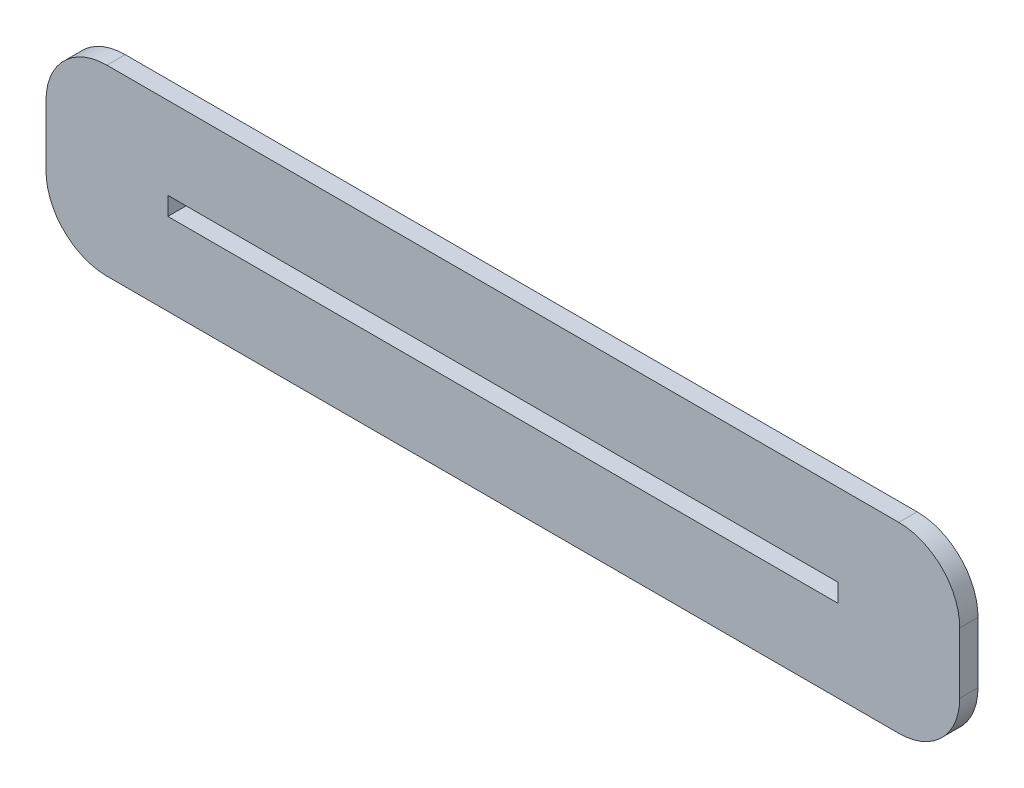
ISO-10303-21;
HEADER;
FILE_DESCRIPTION(('STEP AP214'),'2;1');
FILE_NAME('part.step','',(''),(''),'','','');
FILE_SCHEMA(('AUTOMOTIVE_DESIGN { 1 0 10303 214 1 1 1 1 }'));
ENDSEC;
DATA;
#1=APPLICATION_CONTEXT('core data for automotive mechanical design processes');
#2=APPLICATION_PROTOCOL_DEFINITION('international standard','automotive_design',2000,#1);
#3=PRODUCT_CONTEXT('',#1,'mechanical');
#4=PRODUCT('Part','Part','',(#3));
#5=PRODUCT_RELATED_PRODUCT_CATEGORY('part','',(#4));
#6=PRODUCT_DEFINITION_FORMATION('','',#4);
#7=PRODUCT_DEFINITION_CONTEXT('part definition',#1,'design');
#8=PRODUCT_DEFINITION('design','',#6,#7);
#9=PRODUCT_DEFINITION_SHAPE('','',#8);
#10=(LENGTH_UNIT() NAMED_UNIT(*) SI_UNIT(.MILLI.,.METRE.));
#11=(NAMED_UNIT(*) PLANE_ANGLE_UNIT() SI_UNIT($,.RADIAN.));
#12=(NAMED_UNIT(*) SI_UNIT($,.STERADIAN.) SOLID_ANGLE_UNIT());
#13=UNCERTAINTY_MEASURE_WITH_UNIT(LENGTH_MEASURE(1.E-05),#10,'distance_accuracy_value','');
#14=(GEOMETRIC_REPRESENTATION_CONTEXT(3) GLOBAL_UNCERTAINTY_ASSIGNED_CONTEXT((#13)) GLOBAL_UNIT_ASSIGNED_CONTEXT((#10,
#11,#12)) REPRESENTATION_CONTEXT('',''));
#15=CARTESIAN_POINT('',(0.,0.,0.));
#16=DIRECTION('',(0.,0.,1.));
#17=DIRECTION('',(1.,0.,0.));
#18=AXIS2_PLACEMENT_3D('',#15,#16,#17);
#19=CARTESIAN_POINT('',(0.,30.,3.));
#20=DIRECTION('',(0.,0.,-1.));
#21=DIRECTION('',(-1.,0.,0.));
#22=AXIS2_PLACEMENT_3D('',#19,#20,#21);
#23=PLANE('',#22);
#24=DIRECTION('',(-1.,0.,0.));
#25=VECTOR('',#24,1.);
#26=CARTESIAN_POINT('',(0.,30.,3.));
#27=LINE('',#26,#25);
#28=CARTESIAN_POINT('',(140.,30.,3.));
#29=VERTEX_POINT('',#28);
#30=CARTESIAN_POINT('',(10.,30.,3.));
#31=VERTEX_POINT('',#30);
#32=EDGE_CURVE('E171',#29,#31,#27,.T.);
#33=ORIENTED_EDGE('',*,*,#32,.T.);
#34=CARTESIAN_POINT('',(10.,20.,3.));
#35=DIRECTION('',(0.,0.,-1.));
#36=DIRECTION('',(-1.,0.,0.));
#37=AXIS2_PLACEMENT_3D('',#34,#35,#36);
#38=CIRCLE('',#37,10.);
#39=CARTESIAN_POINT('',(0.,20.,3.));
#40=VERTEX_POINT('',#39);
#41=EDGE_CURVE('E206',#31,#40,#38,.F.);
#42=ORIENTED_EDGE('',*,*,#41,.T.);
#43=DIRECTION('',(0.,-1.,0.));
#44=VECTOR('',#43,1.);
#45=CARTESIAN_POINT('',(0.,0.,3.));
#46=LINE('',#45,#44);
#47=CARTESIAN_POINT('',(0.,10.,3.));
#48=VERTEX_POINT('',#47);
#49=EDGE_CURVE('E163',#40,#48,#46,.T.);
#50=ORIENTED_EDGE('',*,*,#49,.T.);
#51=CARTESIAN_POINT('',(10.,10.,3.));
#52=DIRECTION('',(0.,0.,-1.));
#53=DIRECTION('',(-1.,0.,0.));
#54=AXIS2_PLACEMENT_3D('',#51,#52,#53);
#55=CIRCLE('',#54,10.);
#56=CARTESIAN_POINT('',(10.,0.,3.));
#57=VERTEX_POINT('',#56);
#58=EDGE_CURVE('E204',#48,#57,#55,.F.);
#59=ORIENTED_EDGE('',*,*,#58,.T.);
#60=DIRECTION('',(1.,0.,0.));
#61=VECTOR('',#60,1.);
#62=CARTESIAN_POINT('',(0.,0.,3.));
#63=LINE('',#62,#61);
#64=CARTESIAN_POINT('',(140.,0.,3.));
#65=VERTEX_POINT('',#64);
#66=EDGE_CURVE('E166',#57,#65,#63,.T.);
#67=ORIENTED_EDGE('',*,*,#66,.T.);
#68=CARTESIAN_POINT('',(140.,10.,3.));
#69=DIRECTION('',(0.,0.,-1.));
#70=DIRECTION('',(-1.,0.,0.));
#71=AXIS2_PLACEMENT_3D('',#68,#69,#70);
#72=CIRCLE('',#71,10.);
#73=CARTESIAN_POINT('',(150.,10.,3.));
#74=VERTEX_POINT('',#73);
#75=EDGE_CURVE('E52',#65,#74,#72,.F.);
#76=ORIENTED_EDGE('',*,*,#75,.T.);
#77=DIRECTION('',(0.,1.,0.));
#78=VECTOR('',#77,1.);
#79=CARTESIAN_POINT('',(150.,0.,3.));
#80=LINE('',#79,#78);
#81=CARTESIAN_POINT('',(150.,20.,3.));
#82=VERTEX_POINT('',#81);
#83=EDGE_CURVE('E169',#74,#82,#80,.T.);
#84=ORIENTED_EDGE('',*,*,#83,.T.);
#85=CARTESIAN_POINT('',(140.,20.,3.));
#86=DIRECTION('',(0.,0.,-1.));
#87=DIRECTION('',(-1.,0.,0.));
#88=AXIS2_PLACEMENT_3D('',#85,#86,#87);
#89=CIRCLE('',#88,10.);
#90=EDGE_CURVE('E201',#82,#29,#89,.F.);
#91=ORIENTED_EDGE('',*,*,#90,.T.);
#92=EDGE_LOOP('',(#33,#42,#50,#59,#67,#76,#84,#91));
#93=FACE_BOUND('',#92,.T.);
#94=DIRECTION('',(0.,1.,0.));
#95=VECTOR('',#94,1.);
#96=CARTESIAN_POINT('',(130.,13.5,3.));
#97=LINE('',#96,#95);
#98=CARTESIAN_POINT('',(130.,13.5,3.));
#99=VERTEX_POINT('',#98);
#100=CARTESIAN_POINT('',(130.,16.5,3.));
#101=VERTEX_POINT('',#100);
#102=EDGE_CURVE('E122',#99,#101,#97,.T.);
#103=ORIENTED_EDGE('',*,*,#102,.F.);
#104=DIRECTION('',(1.,0.,0.));
#105=VECTOR('',#104,1.);
#106=CARTESIAN_POINT('',(20.,13.5,3.));
#107=LINE('',#106,#105);
#108=CARTESIAN_POINT('',(20.,13.5,3.));
#109=VERTEX_POINT('',#108);
#110=EDGE_CURVE('E147',#109,#99,#107,.T.);
#111=ORIENTED_EDGE('',*,*,#110,.F.);
#112=DIRECTION('',(0.,-1.,0.));
#113=VECTOR('',#112,1.);
#114=CARTESIAN_POINT('',(20.,13.5,3.));
#115=LINE('',#114,#113);
#116=CARTESIAN_POINT('',(20.,16.5,3.));
#117=VERTEX_POINT('',#116);
#118=EDGE_CURVE('E145',#117,#109,#115,.T.);
#119=ORIENTED_EDGE('',*,*,#118,.F.);
#120=DIRECTION('',(-1.,0.,0.));
#121=VECTOR('',#120,1.);
#122=CARTESIAN_POINT('',(20.,16.5,3.));
#123=LINE('',#122,#121);
#124=EDGE_CURVE('E132',#101,#117,#123,.T.);
#125=ORIENTED_EDGE('',*,*,#124,.F.);
#126=EDGE_LOOP('',(#103,#111,#119,#125));
#127=FACE_BOUND('',#126,.T.);
#128=ADVANCED_FACE('F31',(#93,#127),#23,.F.);
#129=CARTESIAN_POINT('',(0.,30.,0.));
#130=DIRECTION('',(0.,0.,-1.));
#131=DIRECTION('',(-1.,0.,0.));
#132=AXIS2_PLACEMENT_3D('',#129,#130,#131);
#133=PLANE('',#132);
#134=DIRECTION('',(0.,-1.,0.));
#135=VECTOR('',#134,1.);
#136=CARTESIAN_POINT('',(0.,0.,0.));
#137=LINE('',#136,#135);
#138=CARTESIAN_POINT('',(0.,20.,0.));
#139=VERTEX_POINT('',#138);
#140=CARTESIAN_POINT('',(0.,10.,0.));
#141=VERTEX_POINT('',#140);
#142=EDGE_CURVE('E140',#139,#141,#137,.T.);
#143=ORIENTED_EDGE('',*,*,#142,.F.);
#144=CARTESIAN_POINT('',(10.,20.,0.));
#145=DIRECTION('',(0.,0.,-1.));
#146=DIRECTION('',(-1.,0.,0.));
#147=AXIS2_PLACEMENT_3D('',#144,#145,#146);
#148=CIRCLE('',#147,10.);
#149=CARTESIAN_POINT('',(10.,30.,0.));
#150=VERTEX_POINT('',#149);
#151=EDGE_CURVE('E194',#139,#150,#148,.T.);
#152=ORIENTED_EDGE('',*,*,#151,.T.);
#153=DIRECTION('',(-1.,0.,0.));
#154=VECTOR('',#153,1.);
#155=CARTESIAN_POINT('',(0.,30.,0.));
#156=LINE('',#155,#154);
#157=CARTESIAN_POINT('',(140.,30.,0.));
#158=VERTEX_POINT('',#157);
#159=EDGE_CURVE('E167',#158,#150,#156,.T.);
#160=ORIENTED_EDGE('',*,*,#159,.F.);
#161=CARTESIAN_POINT('',(140.,20.,0.));
#162=DIRECTION('',(0.,0.,-1.));
#163=DIRECTION('',(-1.,0.,0.));
#164=AXIS2_PLACEMENT_3D('',#161,#162,#163);
#165=CIRCLE('',#164,10.);
#166=CARTESIAN_POINT('',(150.,20.,0.));
#167=VERTEX_POINT('',#166);
#168=EDGE_CURVE('E188',#158,#167,#165,.T.);
#169=ORIENTED_EDGE('',*,*,#168,.T.);
#170=DIRECTION('',(0.,1.,0.));
#171=VECTOR('',#170,1.);
#172=CARTESIAN_POINT('',(150.,0.,0.));
#173=LINE('',#172,#171);
#174=CARTESIAN_POINT('',(150.,10.,0.));
#175=VERTEX_POINT('',#174);
#176=EDGE_CURVE('E180',#175,#167,#173,.T.);
#177=ORIENTED_EDGE('',*,*,#176,.F.);
#178=CARTESIAN_POINT('',(140.,10.,0.));
#179=DIRECTION('',(0.,0.,-1.));
#180=DIRECTION('',(-1.,0.,0.));
#181=AXIS2_PLACEMENT_3D('',#178,#179,#180);
#182=CIRCLE('',#181,10.);
#183=CARTESIAN_POINT('',(140.,0.,0.));
#184=VERTEX_POINT('',#183);
#185=EDGE_CURVE('E190',#175,#184,#182,.T.);
#186=ORIENTED_EDGE('',*,*,#185,.T.);
#187=DIRECTION('',(1.,0.,0.));
#188=VECTOR('',#187,1.);
#189=CARTESIAN_POINT('',(0.,0.,0.));
#190=LINE('',#189,#188);
#191=CARTESIAN_POINT('',(10.,0.,0.));
#192=VERTEX_POINT('',#191);
#193=EDGE_CURVE('E177',#192,#184,#190,.T.);
#194=ORIENTED_EDGE('',*,*,#193,.F.);
#195=CARTESIAN_POINT('',(10.,10.,0.));
#196=DIRECTION('',(0.,0.,-1.));
#197=DIRECTION('',(-1.,0.,0.));
#198=AXIS2_PLACEMENT_3D('',#195,#196,#197);
#199=CIRCLE('',#198,10.);
#200=EDGE_CURVE('E192',#192,#141,#199,.T.);
#201=ORIENTED_EDGE('',*,*,#200,.T.);
#202=EDGE_LOOP('',(#143,#152,#160,#169,#177,#186,#194,#201));
#203=FACE_BOUND('',#202,.T.);
#204=DIRECTION('',(1.,0.,0.));
#205=VECTOR('',#204,1.);
#206=CARTESIAN_POINT('',(20.,13.5,0.));
#207=LINE('',#206,#205);
#208=CARTESIAN_POINT('',(20.,13.5,0.));
#209=VERTEX_POINT('',#208);
#210=CARTESIAN_POINT('',(130.,13.5,0.));
#211=VERTEX_POINT('',#210);
#212=EDGE_CURVE('E133',#209,#211,#207,.T.);
#213=ORIENTED_EDGE('',*,*,#212,.T.);
#214=DIRECTION('',(0.,1.,0.));
#215=VECTOR('',#214,1.);
#216=CARTESIAN_POINT('',(130.,13.5,0.));
#217=LINE('',#216,#215);
#218=CARTESIAN_POINT('',(130.,16.5,0.));
#219=VERTEX_POINT('',#218);
#220=EDGE_CURVE('E151',#211,#219,#217,.T.);
#221=ORIENTED_EDGE('',*,*,#220,.T.);
#222=DIRECTION('',(-1.,0.,0.));
#223=VECTOR('',#222,1.);
#224=CARTESIAN_POINT('',(20.,16.5,0.));
#225=LINE('',#224,#223);
#226=CARTESIAN_POINT('',(20.,16.5,0.));
#227=VERTEX_POINT('',#226);
#228=EDGE_CURVE('E139',#219,#227,#225,.T.);
#229=ORIENTED_EDGE('',*,*,#228,.T.);
#230=DIRECTION('',(0.,-1.,0.));
#231=VECTOR('',#230,1.);
#232=CARTESIAN_POINT('',(20.,13.5,0.));
#233=LINE('',#232,#231);
#234=EDGE_CURVE('E154',#227,#209,#233,.T.);
#235=ORIENTED_EDGE('',*,*,#234,.T.);
#236=EDGE_LOOP('',(#213,#221,#229,#235));
#237=FACE_BOUND('',#236,.T.);
#238=ADVANCED_FACE('F222',(#203,#237),#133,.T.);
#239=CARTESIAN_POINT('',(0.,0.,3.));
#240=DIRECTION('',(1.,0.,0.));
#241=DIRECTION('',(0.,0.,-1.));
#242=AXIS2_PLACEMENT_3D('',#239,#240,#241);
#243=PLANE('',#242);
#244=ORIENTED_EDGE('',*,*,#49,.F.);
#245=DIRECTION('',(0.,0.,-1.));
#246=VECTOR('',#245,1.);
#247=CARTESIAN_POINT('',(0.,20.,3.));
#248=LINE('',#247,#246);
#249=EDGE_CURVE('E185',#40,#139,#248,.T.);
#250=ORIENTED_EDGE('',*,*,#249,.T.);
#251=ORIENTED_EDGE('',*,*,#142,.T.);
#252=DIRECTION('',(0.,0.,-1.));
#253=VECTOR('',#252,1.);
#254=CARTESIAN_POINT('',(0.,10.,3.));
#255=LINE('',#254,#253);
#256=EDGE_CURVE('E174',#141,#48,#255,.F.);
#257=ORIENTED_EDGE('',*,*,#256,.T.);
#258=EDGE_LOOP('',(#244,#250,#251,#257));
#259=FACE_BOUND('',#258,.T.);
#260=ADVANCED_FACE('F243',(#259),#243,.F.);
#261=CARTESIAN_POINT('',(0.,0.,3.));
#262=DIRECTION('',(0.,1.,0.));
#263=DIRECTION('',(0.,0.,1.));
#264=AXIS2_PLACEMENT_3D('',#261,#262,#263);
#265=PLANE('',#264);
#266=ORIENTED_EDGE('',*,*,#66,.F.);
#267=DIRECTION('',(0.,0.,-1.));
#268=VECTOR('',#267,1.);
#269=CARTESIAN_POINT('',(10.,0.,3.));
#270=LINE('',#269,#268);
#271=EDGE_CURVE('E210',#57,#192,#270,.T.);
#272=ORIENTED_EDGE('',*,*,#271,.T.);
#273=ORIENTED_EDGE('',*,*,#193,.T.);
#274=DIRECTION('',(0.,0.,-1.));
#275=VECTOR('',#274,1.);
#276=CARTESIAN_POINT('',(140.,0.,3.));
#277=LINE('',#276,#275);
#278=EDGE_CURVE('E208',#184,#65,#277,.F.);
#279=ORIENTED_EDGE('',*,*,#278,.T.);
#280=EDGE_LOOP('',(#266,#272,#273,#279));
#281=FACE_BOUND('',#280,.T.);
#282=ADVANCED_FACE('F216',(#281),#265,.F.);
#283=CARTESIAN_POINT('',(150.,0.,3.));
#284=DIRECTION('',(-1.,0.,0.));
#285=DIRECTION('',(0.,0.,1.));
#286=AXIS2_PLACEMENT_3D('',#283,#284,#285);
#287=PLANE('',#286);
#288=ORIENTED_EDGE('',*,*,#83,.F.);
#289=DIRECTION('',(0.,0.,-1.));
#290=VECTOR('',#289,1.);
#291=CARTESIAN_POINT('',(150.,10.,3.));
#292=LINE('',#291,#290);
#293=EDGE_CURVE('E11',#74,#175,#292,.T.);
#294=ORIENTED_EDGE('',*,*,#293,.T.);
#295=ORIENTED_EDGE('',*,*,#176,.T.);
#296=DIRECTION('',(0.,0.,-1.));
#297=VECTOR('',#296,1.);
#298=CARTESIAN_POINT('',(150.,20.,3.));
#299=LINE('',#298,#297);
#300=EDGE_CURVE('E39',#167,#82,#299,.F.);
#301=ORIENTED_EDGE('',*,*,#300,.T.);
#302=EDGE_LOOP('',(#288,#294,#295,#301));
#303=FACE_BOUND('',#302,.T.);
#304=ADVANCED_FACE('F228',(#303),#287,.F.);
#305=CARTESIAN_POINT('',(0.,30.,3.));
#306=DIRECTION('',(0.,-1.,0.));
#307=DIRECTION('',(0.,0.,-1.));
#308=AXIS2_PLACEMENT_3D('',#305,#306,#307);
#309=PLANE('',#308);
#310=ORIENTED_EDGE('',*,*,#159,.T.);
#311=DIRECTION('',(0.,0.,-1.));
#312=VECTOR('',#311,1.);
#313=CARTESIAN_POINT('',(10.,30.,3.));
#314=LINE('',#313,#312);
#315=EDGE_CURVE('E199',#150,#31,#314,.F.);
#316=ORIENTED_EDGE('',*,*,#315,.T.);
#317=ORIENTED_EDGE('',*,*,#32,.F.);
#318=DIRECTION('',(0.,0.,-1.));
#319=VECTOR('',#318,1.);
#320=CARTESIAN_POINT('',(140.,30.,3.));
#321=LINE('',#320,#319);
#322=EDGE_CURVE('E196',#29,#158,#321,.T.);
#323=ORIENTED_EDGE('',*,*,#322,.T.);
#324=EDGE_LOOP('',(#310,#316,#317,#323));
#325=FACE_BOUND('',#324,.T.);
#326=ADVANCED_FACE('F235',(#325),#309,.F.);
#327=CARTESIAN_POINT('',(130.,13.5,3.));
#328=DIRECTION('',(-1.,0.,0.));
#329=DIRECTION('',(0.,0.,1.));
#330=AXIS2_PLACEMENT_3D('',#327,#328,#329);
#331=PLANE('',#330);
#332=ORIENTED_EDGE('',*,*,#220,.F.);
#333=DIRECTION('',(0.,0.,-1.));
#334=VECTOR('',#333,1.);
#335=CARTESIAN_POINT('',(130.,13.5,3.));
#336=LINE('',#335,#334);
#337=EDGE_CURVE('E128',#99,#211,#336,.T.);
#338=ORIENTED_EDGE('',*,*,#337,.F.);
#339=ORIENTED_EDGE('',*,*,#102,.T.);
#340=DIRECTION('',(0.,0.,-1.));
#341=VECTOR('',#340,1.);
#342=CARTESIAN_POINT('',(130.,16.5,3.));
#343=LINE('',#342,#341);
#344=EDGE_CURVE('E125',#101,#219,#343,.T.);
#345=ORIENTED_EDGE('',*,*,#344,.T.);
#346=EDGE_LOOP('',(#332,#338,#339,#345));
#347=FACE_BOUND('',#346,.T.);
#348=ADVANCED_FACE('F124',(#347),#331,.T.);
#349=CARTESIAN_POINT('',(20.,16.5,3.));
#350=DIRECTION('',(0.,-1.,0.));
#351=DIRECTION('',(0.,0.,-1.));
#352=AXIS2_PLACEMENT_3D('',#349,#350,#351);
#353=PLANE('',#352);
#354=ORIENTED_EDGE('',*,*,#228,.F.);
#355=ORIENTED_EDGE('',*,*,#344,.F.);
#356=ORIENTED_EDGE('',*,*,#124,.T.);
#357=DIRECTION('',(0.,0.,-1.));
#358=VECTOR('',#357,1.);
#359=CARTESIAN_POINT('',(20.,16.5,3.));
#360=LINE('',#359,#358);
#361=EDGE_CURVE('E141',#117,#227,#360,.T.);
#362=ORIENTED_EDGE('',*,*,#361,.T.);
#363=EDGE_LOOP('',(#354,#355,#356,#362));
#364=FACE_BOUND('',#363,.T.);
#365=ADVANCED_FACE('F136',(#364),#353,.T.);
#366=CARTESIAN_POINT('',(20.,13.5,3.));
#367=DIRECTION('',(1.,0.,0.));
#368=DIRECTION('',(0.,0.,-1.));
#369=AXIS2_PLACEMENT_3D('',#366,#367,#368);
#370=PLANE('',#369);
#371=ORIENTED_EDGE('',*,*,#234,.F.);
#372=ORIENTED_EDGE('',*,*,#361,.F.);
#373=ORIENTED_EDGE('',*,*,#118,.T.);
#374=DIRECTION('',(0.,0.,-1.));
#375=VECTOR('',#374,1.);
#376=CARTESIAN_POINT('',(20.,13.5,3.));
#377=LINE('',#376,#375);
#378=EDGE_CURVE('E160',#109,#209,#377,.T.);
#379=ORIENTED_EDGE('',*,*,#378,.T.);
#380=EDGE_LOOP('',(#371,#372,#373,#379));
#381=FACE_BOUND('',#380,.T.);
#382=ADVANCED_FACE('F298',(#381),#370,.T.);
#383=CARTESIAN_POINT('',(20.,13.5,3.));
#384=DIRECTION('',(0.,1.,0.));
#385=DIRECTION('',(0.,0.,1.));
#386=AXIS2_PLACEMENT_3D('',#383,#384,#385);
#387=PLANE('',#386);
#388=ORIENTED_EDGE('',*,*,#212,.F.);
#389=ORIENTED_EDGE('',*,*,#378,.F.);
#390=ORIENTED_EDGE('',*,*,#110,.T.);
#391=ORIENTED_EDGE('',*,*,#337,.T.);
#392=EDGE_LOOP('',(#388,#389,#390,#391));
#393=FACE_BOUND('',#392,.T.);
#394=ADVANCED_FACE('F252',(#393),#387,.T.);
#395=CARTESIAN_POINT('',(10.,20.,3.));
#396=DIRECTION('',(0.,0.,-1.));
#397=DIRECTION('',(-1.,0.,0.));
#398=AXIS2_PLACEMENT_3D('',#395,#396,#397);
#399=CYLINDRICAL_SURFACE('',#398,10.);
#400=ORIENTED_EDGE('',*,*,#41,.F.);
#401=ORIENTED_EDGE('',*,*,#315,.F.);
#402=ORIENTED_EDGE('',*,*,#151,.F.);
#403=ORIENTED_EDGE('',*,*,#249,.F.);
#404=EDGE_LOOP('',(#400,#401,#402,#403));
#405=FACE_BOUND('',#404,.T.);
#406=ADVANCED_FACE('F240',(#405),#399,.T.);
#407=CARTESIAN_POINT('',(10.,10.,3.));
#408=DIRECTION('',(0.,0.,-1.));
#409=DIRECTION('',(-1.,0.,0.));
#410=AXIS2_PLACEMENT_3D('',#407,#408,#409);
#411=CYLINDRICAL_SURFACE('',#410,10.);
#412=ORIENTED_EDGE('',*,*,#58,.F.);
#413=ORIENTED_EDGE('',*,*,#256,.F.);
#414=ORIENTED_EDGE('',*,*,#200,.F.);
#415=ORIENTED_EDGE('',*,*,#271,.F.);
#416=EDGE_LOOP('',(#412,#413,#414,#415));
#417=FACE_BOUND('',#416,.T.);
#418=ADVANCED_FACE('F245',(#417),#411,.T.);
#419=CARTESIAN_POINT('',(140.,10.,3.));
#420=DIRECTION('',(0.,0.,-1.));
#421=DIRECTION('',(-1.,0.,0.));
#422=AXIS2_PLACEMENT_3D('',#419,#420,#421);
#423=CYLINDRICAL_SURFACE('',#422,10.);
#424=ORIENTED_EDGE('',*,*,#75,.F.);
#425=ORIENTED_EDGE('',*,*,#278,.F.);
#426=ORIENTED_EDGE('',*,*,#185,.F.);
#427=ORIENTED_EDGE('',*,*,#293,.F.);
#428=EDGE_LOOP('',(#424,#425,#426,#427));
#429=FACE_BOUND('',#428,.T.);
#430=ADVANCED_FACE('F227',(#429),#423,.T.);
#431=CARTESIAN_POINT('',(140.,20.,3.));
#432=DIRECTION('',(0.,0.,-1.));
#433=DIRECTION('',(-1.,0.,0.));
#434=AXIS2_PLACEMENT_3D('',#431,#432,#433);
#435=CYLINDRICAL_SURFACE('',#434,10.);
#436=ORIENTED_EDGE('',*,*,#90,.F.);
#437=ORIENTED_EDGE('',*,*,#300,.F.);
#438=ORIENTED_EDGE('',*,*,#168,.F.);
#439=ORIENTED_EDGE('',*,*,#322,.F.);
#440=EDGE_LOOP('',(#436,#437,#438,#439));
#441=FACE_BOUND('',#440,.T.);
#442=ADVANCED_FACE('F33',(#441),#435,.T.);
#443=CLOSED_SHELL('',(#128,#238,#260,#282,#304,#326,#348,#365,#382,#394,#406,#418,#430,#442));
#444=MANIFOLD_SOLID_BREP('B2',#443);
#445=ADVANCED_BREP_SHAPE_REPRESENTATION('',(#18,#444),#14);
#446=SHAPE_DEFINITION_REPRESENTATION(#9,#445);
ENDSEC;
END-ISO-10303-21;
